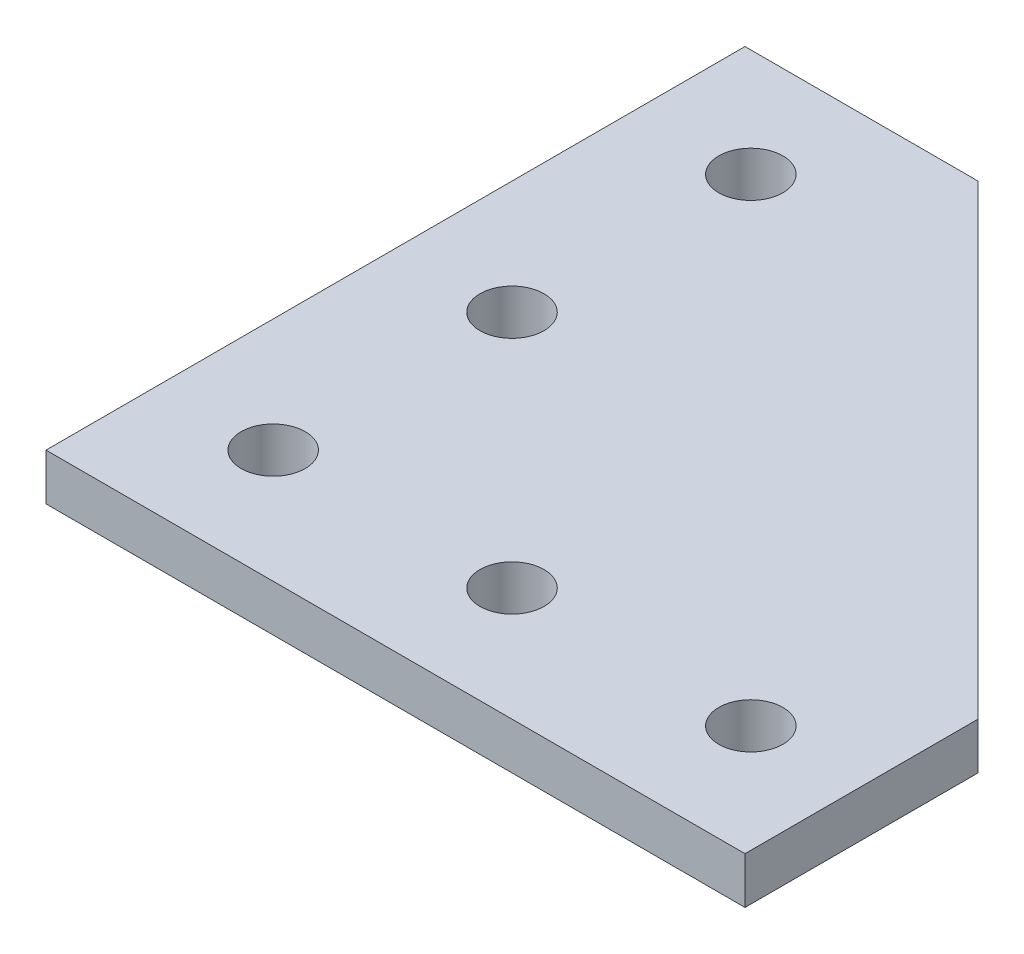
ISO-10303-21;
HEADER;
FILE_DESCRIPTION(('STEP AP214'),'2;1');
FILE_NAME('part.step','',(''),(''),'','','');
FILE_SCHEMA(('AUTOMOTIVE_DESIGN { 1 0 10303 214 1 1 1 1 }'));
ENDSEC;
DATA;
#1=APPLICATION_CONTEXT('core data for automotive mechanical design processes');
#2=APPLICATION_PROTOCOL_DEFINITION('international standard','automotive_design',2000,#1);
#3=PRODUCT_CONTEXT('',#1,'mechanical');
#4=PRODUCT('Part','Part','',(#3));
#5=PRODUCT_RELATED_PRODUCT_CATEGORY('part','',(#4));
#6=PRODUCT_DEFINITION_FORMATION('','',#4);
#7=PRODUCT_DEFINITION_CONTEXT('part definition',#1,'design');
#8=PRODUCT_DEFINITION('design','',#6,#7);
#9=PRODUCT_DEFINITION_SHAPE('','',#8);
#10=(LENGTH_UNIT() NAMED_UNIT(*) SI_UNIT(.MILLI.,.METRE.));
#11=(NAMED_UNIT(*) PLANE_ANGLE_UNIT() SI_UNIT($,.RADIAN.));
#12=(NAMED_UNIT(*) SI_UNIT($,.STERADIAN.) SOLID_ANGLE_UNIT());
#13=UNCERTAINTY_MEASURE_WITH_UNIT(LENGTH_MEASURE(1.E-05),#10,'distance_accuracy_value','');
#14=(GEOMETRIC_REPRESENTATION_CONTEXT(3) GLOBAL_UNCERTAINTY_ASSIGNED_CONTEXT((#13)) GLOBAL_UNIT_ASSIGNED_CONTEXT((#10,
#11,#12)) REPRESENTATION_CONTEXT('',''));
#15=CARTESIAN_POINT('',(0.,0.,0.));
#16=DIRECTION('',(0.,0.,1.));
#17=DIRECTION('',(1.,0.,0.));
#18=AXIS2_PLACEMENT_3D('',#15,#16,#17);
#19=CARTESIAN_POINT('',(40.75,-2.,0.249999999999993));
#20=DIRECTION('',(0.,1.,0.));
#21=DIRECTION('',(0.,0.,1.));
#22=AXIS2_PLACEMENT_3D('',#19,#20,#21);
#23=CYLINDRICAL_SURFACE('',#22,2.75);
#24=CARTESIAN_POINT('',(40.75,2.,0.249999999999993));
#25=DIRECTION('',(0.,1.,0.));
#26=DIRECTION('',(0.,0.,1.));
#27=AXIS2_PLACEMENT_3D('',#24,#25,#26);
#28=CIRCLE('',#27,2.75);
#29=CARTESIAN_POINT('',(40.75,2.,2.99999999999999));
#30=VERTEX_POINT('',#29);
#31=EDGE_CURVE('E50',#30,#30,#28,.T.);
#32=ORIENTED_EDGE('',*,*,#31,.T.);
#33=EDGE_LOOP('',(#32));
#34=FACE_BOUND('',#33,.T.);
#35=CARTESIAN_POINT('',(40.75,-2.,0.249999999999993));
#36=DIRECTION('',(0.,1.,0.));
#37=DIRECTION('',(0.,0.,1.));
#38=AXIS2_PLACEMENT_3D('',#35,#36,#37);
#39=CIRCLE('',#38,2.75);
#40=CARTESIAN_POINT('',(40.75,-2.,2.99999999999999));
#41=VERTEX_POINT('',#40);
#42=EDGE_CURVE('E11',#41,#41,#39,.T.);
#43=ORIENTED_EDGE('',*,*,#42,.F.);
#44=EDGE_LOOP('',(#43));
#45=FACE_BOUND('',#44,.T.);
#46=ADVANCED_FACE('F41',(#34,#45),#23,.F.);
#47=CARTESIAN_POINT('',(20.25,-2.,0.24999999999999));
#48=DIRECTION('',(0.,1.,0.));
#49=DIRECTION('',(0.,0.,1.));
#50=AXIS2_PLACEMENT_3D('',#47,#48,#49);
#51=CYLINDRICAL_SURFACE('',#50,2.75);
#52=CARTESIAN_POINT('',(20.25,2.,0.24999999999999));
#53=DIRECTION('',(0.,1.,0.));
#54=DIRECTION('',(0.,0.,1.));
#55=AXIS2_PLACEMENT_3D('',#52,#53,#54);
#56=CIRCLE('',#55,2.75);
#57=CARTESIAN_POINT('',(20.25,2.,2.99999999999999));
#58=VERTEX_POINT('',#57);
#59=EDGE_CURVE('E155',#58,#58,#56,.T.);
#60=ORIENTED_EDGE('',*,*,#59,.T.);
#61=EDGE_LOOP('',(#60));
#62=FACE_BOUND('',#61,.T.);
#63=CARTESIAN_POINT('',(20.25,-2.,0.24999999999999));
#64=DIRECTION('',(0.,1.,0.));
#65=DIRECTION('',(0.,0.,1.));
#66=AXIS2_PLACEMENT_3D('',#63,#64,#65);
#67=CIRCLE('',#66,2.75);
#68=CARTESIAN_POINT('',(20.25,-2.,2.99999999999999));
#69=VERTEX_POINT('',#68);
#70=EDGE_CURVE('E159',#69,#69,#67,.T.);
#71=ORIENTED_EDGE('',*,*,#70,.F.);
#72=EDGE_LOOP('',(#71));
#73=FACE_BOUND('',#72,.T.);
#74=ADVANCED_FACE('F185',(#62,#73),#51,.F.);
#75=CARTESIAN_POINT('',(-0.24999999999998,-2.,-40.75));
#76=DIRECTION('',(0.,1.,0.));
#77=DIRECTION('',(0.,0.,1.));
#78=AXIS2_PLACEMENT_3D('',#75,#76,#77);
#79=CYLINDRICAL_SURFACE('',#78,2.75);
#80=CARTESIAN_POINT('',(-0.24999999999998,2.,-40.75));
#81=DIRECTION('',(0.,1.,0.));
#82=DIRECTION('',(0.,0.,1.));
#83=AXIS2_PLACEMENT_3D('',#80,#81,#82);
#84=CIRCLE('',#83,2.75);
#85=CARTESIAN_POINT('',(-0.24999999999998,2.,-38.));
#86=VERTEX_POINT('',#85);
#87=EDGE_CURVE('E147',#86,#86,#84,.T.);
#88=ORIENTED_EDGE('',*,*,#87,.T.);
#89=EDGE_LOOP('',(#88));
#90=FACE_BOUND('',#89,.T.);
#91=CARTESIAN_POINT('',(-0.24999999999998,-2.,-40.75));
#92=DIRECTION('',(0.,1.,0.));
#93=DIRECTION('',(0.,0.,1.));
#94=AXIS2_PLACEMENT_3D('',#91,#92,#93);
#95=CIRCLE('',#94,2.75);
#96=CARTESIAN_POINT('',(-0.24999999999998,-2.,-38.));
#97=VERTEX_POINT('',#96);
#98=EDGE_CURVE('E151',#97,#97,#95,.T.);
#99=ORIENTED_EDGE('',*,*,#98,.F.);
#100=EDGE_LOOP('',(#99));
#101=FACE_BOUND('',#100,.T.);
#102=ADVANCED_FACE('F189',(#90,#101),#79,.F.);
#103=CARTESIAN_POINT('',(-9.99999999999998,2.,-50.));
#104=DIRECTION('',(1.,0.,0.));
#105=DIRECTION('',(0.,0.,-1.));
#106=AXIS2_PLACEMENT_3D('',#103,#104,#105);
#107=PLANE('',#106);
#108=DIRECTION('',(0.,0.,1.));
#109=VECTOR('',#108,1.);
#110=CARTESIAN_POINT('',(-9.99999999999998,-2.,-50.));
#111=LINE('',#110,#109);
#112=CARTESIAN_POINT('',(-9.99999999999998,-2.,-50.));
#113=VERTEX_POINT('',#112);
#114=CARTESIAN_POINT('',(-9.99999999999999,-2.,9.99999999999999));
#115=VERTEX_POINT('',#114);
#116=EDGE_CURVE('E123',#113,#115,#111,.T.);
#117=ORIENTED_EDGE('',*,*,#116,.T.);
#118=DIRECTION('',(0.,-1.,0.));
#119=VECTOR('',#118,1.);
#120=CARTESIAN_POINT('',(-9.99999999999999,2.,9.99999999999999));
#121=LINE('',#120,#119);
#122=CARTESIAN_POINT('',(-9.99999999999999,2.,9.99999999999999));
#123=VERTEX_POINT('',#122);
#124=EDGE_CURVE('E144',#123,#115,#121,.T.);
#125=ORIENTED_EDGE('',*,*,#124,.F.);
#126=DIRECTION('',(0.,0.,1.));
#127=VECTOR('',#126,1.);
#128=CARTESIAN_POINT('',(-9.99999999999998,2.,-50.));
#129=LINE('',#128,#127);
#130=CARTESIAN_POINT('',(-9.99999999999998,2.,-50.));
#131=VERTEX_POINT('',#130);
#132=EDGE_CURVE('E137',#131,#123,#129,.T.);
#133=ORIENTED_EDGE('',*,*,#132,.F.);
#134=DIRECTION('',(0.,-1.,0.));
#135=VECTOR('',#134,1.);
#136=CARTESIAN_POINT('',(-9.99999999999998,2.,-50.));
#137=LINE('',#136,#135);
#138=EDGE_CURVE('E119',#131,#113,#137,.T.);
#139=ORIENTED_EDGE('',*,*,#138,.T.);
#140=EDGE_LOOP('',(#117,#125,#133,#139));
#141=FACE_BOUND('',#140,.T.);
#142=ADVANCED_FACE('F194',(#141),#107,.F.);
#143=CARTESIAN_POINT('',(-9.99999999999999,2.,9.99999999999999));
#144=DIRECTION('',(0.,0.,-1.));
#145=DIRECTION('',(-1.,0.,0.));
#146=AXIS2_PLACEMENT_3D('',#143,#144,#145);
#147=PLANE('',#146);
#148=DIRECTION('',(1.,0.,0.));
#149=VECTOR('',#148,1.);
#150=CARTESIAN_POINT('',(-9.99999999999999,-2.,9.99999999999999));
#151=LINE('',#150,#149);
#152=CARTESIAN_POINT('',(50.,-2.,9.99999999999999));
#153=VERTEX_POINT('',#152);
#154=EDGE_CURVE('E127',#115,#153,#151,.T.);
#155=ORIENTED_EDGE('',*,*,#154,.T.);
#156=DIRECTION('',(0.,-1.,0.));
#157=VECTOR('',#156,1.);
#158=CARTESIAN_POINT('',(50.,2.,9.99999999999999));
#159=LINE('',#158,#157);
#160=CARTESIAN_POINT('',(50.,2.,9.99999999999999));
#161=VERTEX_POINT('',#160);
#162=EDGE_CURVE('E112',#161,#153,#159,.T.);
#163=ORIENTED_EDGE('',*,*,#162,.F.);
#164=DIRECTION('',(1.,0.,0.));
#165=VECTOR('',#164,1.);
#166=CARTESIAN_POINT('',(-9.99999999999999,2.,9.99999999999999));
#167=LINE('',#166,#165);
#168=EDGE_CURVE('E93',#123,#161,#167,.T.);
#169=ORIENTED_EDGE('',*,*,#168,.F.);
#170=ORIENTED_EDGE('',*,*,#124,.T.);
#171=EDGE_LOOP('',(#155,#163,#169,#170));
#172=FACE_BOUND('',#171,.T.);
#173=ADVANCED_FACE('F201',(#172),#147,.F.);
#174=CARTESIAN_POINT('',(50.,2.,9.99999999999999));
#175=DIRECTION('',(-1.,0.,0.));
#176=DIRECTION('',(0.,0.,1.));
#177=AXIS2_PLACEMENT_3D('',#174,#175,#176);
#178=PLANE('',#177);
#179=DIRECTION('',(0.,0.,-1.));
#180=VECTOR('',#179,1.);
#181=CARTESIAN_POINT('',(50.,-2.,9.99999999999999));
#182=LINE('',#181,#180);
#183=CARTESIAN_POINT('',(50.,-2.,-10.));
#184=VERTEX_POINT('',#183);
#185=EDGE_CURVE('E110',#153,#184,#182,.T.);
#186=ORIENTED_EDGE('',*,*,#185,.T.);
#187=DIRECTION('',(0.,-1.,0.));
#188=VECTOR('',#187,1.);
#189=CARTESIAN_POINT('',(50.,2.,-10.));
#190=LINE('',#189,#188);
#191=CARTESIAN_POINT('',(50.,2.,-10.));
#192=VERTEX_POINT('',#191);
#193=EDGE_CURVE('E107',#192,#184,#190,.T.);
#194=ORIENTED_EDGE('',*,*,#193,.F.);
#195=DIRECTION('',(0.,0.,-1.));
#196=VECTOR('',#195,1.);
#197=CARTESIAN_POINT('',(50.,2.,9.99999999999999));
#198=LINE('',#197,#196);
#199=EDGE_CURVE('E97',#161,#192,#198,.T.);
#200=ORIENTED_EDGE('',*,*,#199,.F.);
#201=ORIENTED_EDGE('',*,*,#162,.T.);
#202=EDGE_LOOP('',(#186,#194,#200,#201));
#203=FACE_BOUND('',#202,.T.);
#204=ADVANCED_FACE('F108',(#203),#178,.F.);
#205=CARTESIAN_POINT('',(50.,2.,-10.));
#206=DIRECTION('',(-0.707106781186548,0.,0.707106781186547));
#207=DIRECTION('',(0.707106781186547,0.,0.707106781186548));
#208=AXIS2_PLACEMENT_3D('',#205,#206,#207);
#209=PLANE('',#208);
#210=DIRECTION('',(-0.707106781186547,0.,-0.707106781186548));
#211=VECTOR('',#210,1.);
#212=CARTESIAN_POINT('',(50.,-2.,-10.));
#213=LINE('',#212,#211);
#214=CARTESIAN_POINT('',(10.,-2.,-50.));
#215=VERTEX_POINT('',#214);
#216=EDGE_CURVE('E78',#184,#215,#213,.T.);
#217=ORIENTED_EDGE('',*,*,#216,.T.);
#218=DIRECTION('',(0.,-1.,0.));
#219=VECTOR('',#218,1.);
#220=CARTESIAN_POINT('',(10.,2.,-50.));
#221=LINE('',#220,#219);
#222=CARTESIAN_POINT('',(10.,2.,-50.));
#223=VERTEX_POINT('',#222);
#224=EDGE_CURVE('E113',#223,#215,#221,.T.);
#225=ORIENTED_EDGE('',*,*,#224,.F.);
#226=DIRECTION('',(-0.707106781186547,0.,-0.707106781186548));
#227=VECTOR('',#226,1.);
#228=CARTESIAN_POINT('',(50.,2.,-10.));
#229=LINE('',#228,#227);
#230=EDGE_CURVE('E102',#192,#223,#229,.T.);
#231=ORIENTED_EDGE('',*,*,#230,.F.);
#232=ORIENTED_EDGE('',*,*,#193,.T.);
#233=EDGE_LOOP('',(#217,#225,#231,#232));
#234=FACE_BOUND('',#233,.T.);
#235=ADVANCED_FACE('F115',(#234),#209,.F.);
#236=CARTESIAN_POINT('',(10.,2.,-50.));
#237=DIRECTION('',(0.,0.,1.));
#238=DIRECTION('',(1.,0.,0.));
#239=AXIS2_PLACEMENT_3D('',#236,#237,#238);
#240=PLANE('',#239);
#241=DIRECTION('',(-1.,0.,0.));
#242=VECTOR('',#241,1.);
#243=CARTESIAN_POINT('',(10.,-2.,-50.));
#244=LINE('',#243,#242);
#245=EDGE_CURVE('E84',#215,#113,#244,.T.);
#246=ORIENTED_EDGE('',*,*,#245,.T.);
#247=ORIENTED_EDGE('',*,*,#138,.F.);
#248=DIRECTION('',(-1.,0.,0.));
#249=VECTOR('',#248,1.);
#250=CARTESIAN_POINT('',(10.,2.,-50.));
#251=LINE('',#250,#249);
#252=EDGE_CURVE('E58',#223,#131,#251,.T.);
#253=ORIENTED_EDGE('',*,*,#252,.F.);
#254=ORIENTED_EDGE('',*,*,#224,.T.);
#255=EDGE_LOOP('',(#246,#247,#253,#254));
#256=FACE_BOUND('',#255,.T.);
#257=ADVANCED_FACE('F170',(#256),#240,.F.);
#258=CARTESIAN_POINT('',(0.,2.,0.));
#259=DIRECTION('',(0.,1.,0.));
#260=DIRECTION('',(0.,0.,1.));
#261=AXIS2_PLACEMENT_3D('',#258,#259,#260);
#262=PLANE('',#261);
#263=CARTESIAN_POINT('',(-0.249999999999982,2.,-20.25));
#264=DIRECTION('',(0.,1.,0.));
#265=DIRECTION('',(0.,0.,1.));
#266=AXIS2_PLACEMENT_3D('',#263,#264,#265);
#267=CIRCLE('',#266,2.75);
#268=CARTESIAN_POINT('',(-0.249999999999982,2.,-17.5));
#269=VERTEX_POINT('',#268);
#270=EDGE_CURVE('E264',#269,#269,#267,.T.);
#271=ORIENTED_EDGE('',*,*,#270,.F.);
#272=EDGE_LOOP('',(#271));
#273=FACE_BOUND('',#272,.T.);
#274=CARTESIAN_POINT('',(-0.249999999999985,2.,0.249999999999992));
#275=DIRECTION('',(0.,1.,0.));
#276=DIRECTION('',(0.,0.,1.));
#277=AXIS2_PLACEMENT_3D('',#274,#275,#276);
#278=CIRCLE('',#277,2.75);
#279=CARTESIAN_POINT('',(-0.249999999999985,2.,2.99999999999999));
#280=VERTEX_POINT('',#279);
#281=EDGE_CURVE('E128',#280,#280,#278,.T.);
#282=ORIENTED_EDGE('',*,*,#281,.F.);
#283=EDGE_LOOP('',(#282));
#284=FACE_BOUND('',#283,.T.);
#285=ORIENTED_EDGE('',*,*,#132,.T.);
#286=ORIENTED_EDGE('',*,*,#168,.T.);
#287=ORIENTED_EDGE('',*,*,#199,.T.);
#288=ORIENTED_EDGE('',*,*,#230,.T.);
#289=ORIENTED_EDGE('',*,*,#252,.T.);
#290=EDGE_LOOP('',(#285,#286,#287,#288,#289));
#291=FACE_BOUND('',#290,.T.);
#292=ORIENTED_EDGE('',*,*,#87,.F.);
#293=EDGE_LOOP('',(#292));
#294=FACE_BOUND('',#293,.T.);
#295=ORIENTED_EDGE('',*,*,#59,.F.);
#296=EDGE_LOOP('',(#295));
#297=FACE_BOUND('',#296,.T.);
#298=ORIENTED_EDGE('',*,*,#31,.F.);
#299=EDGE_LOOP('',(#298));
#300=FACE_BOUND('',#299,.T.);
#301=ADVANCED_FACE('F99',(#273,#284,#291,#294,#297,#300),#262,.T.);
#302=CARTESIAN_POINT('',(0.,-2.,0.));
#303=DIRECTION('',(0.,1.,0.));
#304=DIRECTION('',(0.,0.,1.));
#305=AXIS2_PLACEMENT_3D('',#302,#303,#304);
#306=PLANE('',#305);
#307=CARTESIAN_POINT('',(-0.249999999999982,-2.,-20.25));
#308=DIRECTION('',(0.,1.,0.));
#309=DIRECTION('',(0.,0.,1.));
#310=AXIS2_PLACEMENT_3D('',#307,#308,#309);
#311=CIRCLE('',#310,2.75);
#312=CARTESIAN_POINT('',(-0.249999999999982,-2.,-17.5));
#313=VERTEX_POINT('',#312);
#314=EDGE_CURVE('E267',#313,#313,#311,.T.);
#315=ORIENTED_EDGE('',*,*,#314,.T.);
#316=EDGE_LOOP('',(#315));
#317=FACE_BOUND('',#316,.T.);
#318=CARTESIAN_POINT('',(-0.249999999999985,-2.,0.249999999999992));
#319=DIRECTION('',(0.,1.,0.));
#320=DIRECTION('',(0.,0.,1.));
#321=AXIS2_PLACEMENT_3D('',#318,#319,#320);
#322=CIRCLE('',#321,2.75);
#323=CARTESIAN_POINT('',(-0.249999999999985,-2.,2.99999999999999));
#324=VERTEX_POINT('',#323);
#325=EDGE_CURVE('E269',#324,#324,#322,.T.);
#326=ORIENTED_EDGE('',*,*,#325,.T.);
#327=EDGE_LOOP('',(#326));
#328=FACE_BOUND('',#327,.T.);
#329=ORIENTED_EDGE('',*,*,#116,.F.);
#330=ORIENTED_EDGE('',*,*,#245,.F.);
#331=ORIENTED_EDGE('',*,*,#216,.F.);
#332=ORIENTED_EDGE('',*,*,#185,.F.);
#333=ORIENTED_EDGE('',*,*,#154,.F.);
#334=EDGE_LOOP('',(#329,#330,#331,#332,#333));
#335=FACE_BOUND('',#334,.T.);
#336=ORIENTED_EDGE('',*,*,#98,.T.);
#337=EDGE_LOOP('',(#336));
#338=FACE_BOUND('',#337,.T.);
#339=ORIENTED_EDGE('',*,*,#70,.T.);
#340=EDGE_LOOP('',(#339));
#341=FACE_BOUND('',#340,.T.);
#342=ORIENTED_EDGE('',*,*,#42,.T.);
#343=EDGE_LOOP('',(#342));
#344=FACE_BOUND('',#343,.T.);
#345=ADVANCED_FACE('F169',(#317,#328,#335,#338,#341,#344),#306,.F.);
#346=CARTESIAN_POINT('',(-0.249999999999985,-2.,0.249999999999992));
#347=DIRECTION('',(0.,1.,0.));
#348=DIRECTION('',(0.,0.,1.));
#349=AXIS2_PLACEMENT_3D('',#346,#347,#348);
#350=CYLINDRICAL_SURFACE('',#349,2.75);
#351=ORIENTED_EDGE('',*,*,#281,.T.);
#352=EDGE_LOOP('',(#351));
#353=FACE_BOUND('',#352,.T.);
#354=ORIENTED_EDGE('',*,*,#325,.F.);
#355=EDGE_LOOP('',(#354));
#356=FACE_BOUND('',#355,.T.);
#357=ADVANCED_FACE('F177',(#353,#356),#350,.F.);
#358=CARTESIAN_POINT('',(-0.249999999999982,-2.,-20.25));
#359=DIRECTION('',(0.,1.,0.));
#360=DIRECTION('',(0.,0.,1.));
#361=AXIS2_PLACEMENT_3D('',#358,#359,#360);
#362=CYLINDRICAL_SURFACE('',#361,2.75);
#363=ORIENTED_EDGE('',*,*,#270,.T.);
#364=EDGE_LOOP('',(#363));
#365=FACE_BOUND('',#364,.T.);
#366=ORIENTED_EDGE('',*,*,#314,.F.);
#367=EDGE_LOOP('',(#366));
#368=FACE_BOUND('',#367,.T.);
#369=ADVANCED_FACE('F225',(#365,#368),#362,.F.);
#370=CLOSED_SHELL('',(#46,#74,#102,#142,#173,#204,#235,#257,#301,#345,#357,#369));
#371=MANIFOLD_SOLID_BREP('B2',#370);
#372=ADVANCED_BREP_SHAPE_REPRESENTATION('',(#18,#371),#14);
#373=SHAPE_DEFINITION_REPRESENTATION(#9,#372);
ENDSEC;
END-ISO-10303-21;
